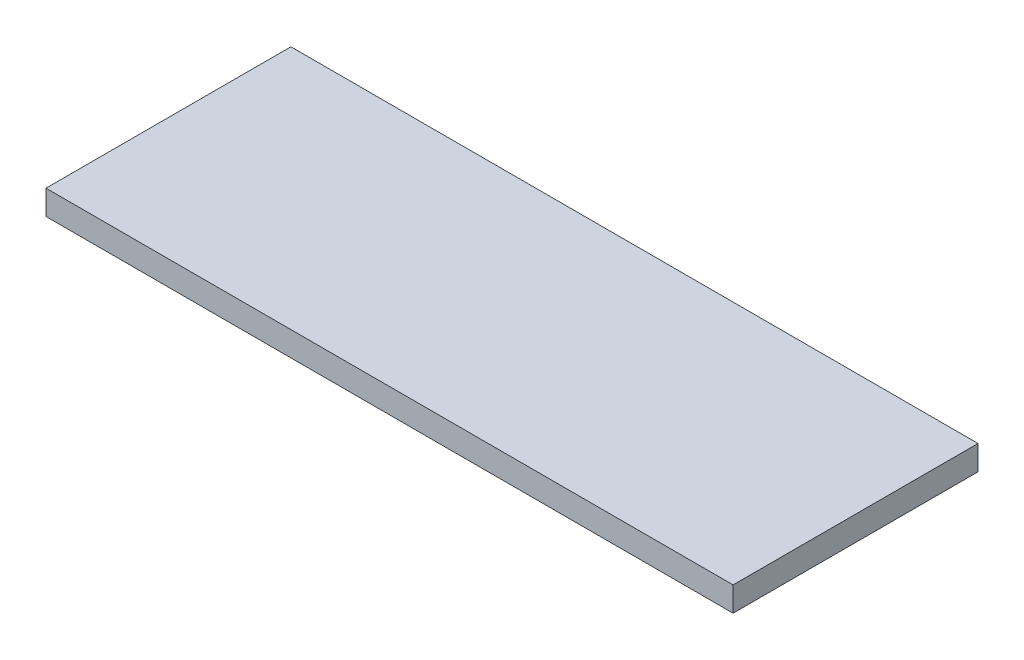
ISO-10303-21;
HEADER;
FILE_DESCRIPTION(('STEP AP214'),'2;1');
FILE_NAME('part.step','',(''),(''),'','','');
FILE_SCHEMA(('AUTOMOTIVE_DESIGN { 1 0 10303 214 1 1 1 1 }'));
ENDSEC;
DATA;
#1=APPLICATION_CONTEXT('core data for automotive mechanical design processes');
#2=APPLICATION_PROTOCOL_DEFINITION('international standard','automotive_design',2000,#1);
#3=PRODUCT_CONTEXT('',#1,'mechanical');
#4=PRODUCT('Part','Part','',(#3));
#5=PRODUCT_RELATED_PRODUCT_CATEGORY('part','',(#4));
#6=PRODUCT_DEFINITION_FORMATION('','',#4);
#7=PRODUCT_DEFINITION_CONTEXT('part definition',#1,'design');
#8=PRODUCT_DEFINITION('design','',#6,#7);
#9=PRODUCT_DEFINITION_SHAPE('','',#8);
#10=(LENGTH_UNIT() NAMED_UNIT(*) SI_UNIT(.MILLI.,.METRE.));
#11=(NAMED_UNIT(*) PLANE_ANGLE_UNIT() SI_UNIT($,.RADIAN.));
#12=(NAMED_UNIT(*) SI_UNIT($,.STERADIAN.) SOLID_ANGLE_UNIT());
#13=UNCERTAINTY_MEASURE_WITH_UNIT(LENGTH_MEASURE(1.E-05),#10,'distance_accuracy_value','');
#14=(GEOMETRIC_REPRESENTATION_CONTEXT(3) GLOBAL_UNCERTAINTY_ASSIGNED_CONTEXT((#13)) GLOBAL_UNIT_ASSIGNED_CONTEXT((#10,
#11,#12)) REPRESENTATION_CONTEXT('',''));
#15=CARTESIAN_POINT('',(0.,0.,0.));
#16=DIRECTION('',(0.,0.,1.));
#17=DIRECTION('',(1.,0.,0.));
#18=AXIS2_PLACEMENT_3D('',#15,#16,#17);
#19=CARTESIAN_POINT('',(-605.779914326901,-4.,0.));
#20=DIRECTION('',(-1.,0.,0.));
#21=DIRECTION('',(0.,0.,1.));
#22=AXIS2_PLACEMENT_3D('',#19,#20,#21);
#23=PLANE('',#22);
#24=DIRECTION('',(0.,0.,1.));
#25=VECTOR('',#24,1.);
#26=CARTESIAN_POINT('',(-605.779914326901,6.,-285.303611354948));
#27=LINE('',#26,#25);
#28=CARTESIAN_POINT('',(-605.779914326901,6.,-285.203611354948));
#29=VERTEX_POINT('',#28);
#30=CARTESIAN_POINT('',(-605.779914326901,6.,-185.403611354948));
#31=VERTEX_POINT('',#30);
#32=EDGE_CURVE('E116',#29,#31,#27,.T.);
#33=ORIENTED_EDGE('',*,*,#32,.F.);
#34=DIRECTION('',(0.,1.,0.));
#35=VECTOR('',#34,1.);
#36=CARTESIAN_POINT('',(-605.779914326901,6.,-285.203611354948));
#37=LINE('',#36,#35);
#38=CARTESIAN_POINT('',(-605.779914326901,-4.,-285.203611354948));
#39=VERTEX_POINT('',#38);
#40=EDGE_CURVE('E60',#39,#29,#37,.T.);
#41=ORIENTED_EDGE('',*,*,#40,.F.);
#42=DIRECTION('',(0.,0.,1.));
#43=VECTOR('',#42,1.);
#44=CARTESIAN_POINT('',(-605.779914326901,-4.,0.));
#45=LINE('',#44,#43);
#46=CARTESIAN_POINT('',(-605.779914326901,-4.,-185.403611354948));
#47=VERTEX_POINT('',#46);
#48=EDGE_CURVE('E100',#39,#47,#45,.T.);
#49=ORIENTED_EDGE('',*,*,#48,.T.);
#50=DIRECTION('',(0.,-1.,0.));
#51=VECTOR('',#50,1.);
#52=CARTESIAN_POINT('',(-605.779914326901,6.,-185.403611354948));
#53=LINE('',#52,#51);
#54=EDGE_CURVE('E126',#31,#47,#53,.T.);
#55=ORIENTED_EDGE('',*,*,#54,.F.);
#56=EDGE_LOOP('',(#33,#41,#49,#55));
#57=FACE_BOUND('',#56,.T.);
#58=ADVANCED_FACE('F43',(#57),#23,.T.);
#59=CARTESIAN_POINT('',(-325.779914326901,-4.,0.));
#60=DIRECTION('',(-1.,0.,0.));
#61=DIRECTION('',(0.,0.,1.));
#62=AXIS2_PLACEMENT_3D('',#59,#60,#61);
#63=PLANE('',#62);
#64=DIRECTION('',(0.,-1.,0.));
#65=VECTOR('',#64,1.);
#66=CARTESIAN_POINT('',(-325.779914326901,6.,-285.203611354948));
#67=LINE('',#66,#65);
#68=CARTESIAN_POINT('',(-325.779914326901,6.,-285.203611354948));
#69=VERTEX_POINT('',#68);
#70=CARTESIAN_POINT('',(-325.779914326901,-4.,-285.203611354948));
#71=VERTEX_POINT('',#70);
#72=EDGE_CURVE('E86',#69,#71,#67,.T.);
#73=ORIENTED_EDGE('',*,*,#72,.F.);
#74=DIRECTION('',(0.,0.,-1.));
#75=VECTOR('',#74,1.);
#76=CARTESIAN_POINT('',(-325.779914326901,6.,-285.303611354948));
#77=LINE('',#76,#75);
#78=CARTESIAN_POINT('',(-325.779914326901,6.,-185.403611354948));
#79=VERTEX_POINT('',#78);
#80=EDGE_CURVE('E113',#79,#69,#77,.T.);
#81=ORIENTED_EDGE('',*,*,#80,.F.);
#82=DIRECTION('',(0.,1.,0.));
#83=VECTOR('',#82,1.);
#84=CARTESIAN_POINT('',(-325.779914326901,6.,-185.403611354948));
#85=LINE('',#84,#83);
#86=CARTESIAN_POINT('',(-325.779914326901,-4.,-185.403611354948));
#87=VERTEX_POINT('',#86);
#88=EDGE_CURVE('E68',#87,#79,#85,.T.);
#89=ORIENTED_EDGE('',*,*,#88,.F.);
#90=DIRECTION('',(0.,0.,1.));
#91=VECTOR('',#90,1.);
#92=CARTESIAN_POINT('',(-325.779914326901,-4.,0.));
#93=LINE('',#92,#91);
#94=EDGE_CURVE('E52',#71,#87,#93,.T.);
#95=ORIENTED_EDGE('',*,*,#94,.F.);
#96=EDGE_LOOP('',(#73,#81,#89,#95));
#97=FACE_BOUND('',#96,.T.);
#98=ADVANCED_FACE('F102',(#97),#63,.F.);
#99=CARTESIAN_POINT('',(0.,-4.,0.));
#100=DIRECTION('',(0.,1.,0.));
#101=DIRECTION('',(0.,0.,1.));
#102=AXIS2_PLACEMENT_3D('',#99,#100,#101);
#103=PLANE('',#102);
#104=CARTESIAN_POINT('',(-402.392880512729,-4.,-240.117860910898));
#105=DIRECTION('',(0.,1.,0.));
#106=DIRECTION('',(0.,0.,1.));
#107=AXIS2_PLACEMENT_3D('',#104,#105,#106);
#108=CIRCLE('',#107,18.55);
#109=CARTESIAN_POINT('',(-402.392880512729,-4.,-221.567860910898));
#110=VERTEX_POINT('',#109);
#111=EDGE_CURVE('E104',#110,#110,#108,.T.);
#112=ORIENTED_EDGE('',*,*,#111,.T.);
#113=EDGE_LOOP('',(#112));
#114=FACE_BOUND('',#113,.T.);
#115=CARTESIAN_POINT('',(-581.279914326901,-4.,-209.803611354948));
#116=DIRECTION('',(0.,1.,0.));
#117=DIRECTION('',(0.,0.,1.));
#118=AXIS2_PLACEMENT_3D('',#115,#116,#117);
#119=CIRCLE('',#118,18.55);
#120=CARTESIAN_POINT('',(-581.279914326901,-4.,-191.253611354948));
#121=VERTEX_POINT('',#120);
#122=EDGE_CURVE('E11',#121,#121,#119,.T.);
#123=ORIENTED_EDGE('',*,*,#122,.T.);
#124=EDGE_LOOP('',(#123));
#125=FACE_BOUND('',#124,.T.);
#126=DIRECTION('',(-1.,0.,0.));
#127=VECTOR('',#126,1.);
#128=CARTESIAN_POINT('',(-325.779914326901,-4.,-285.203611354948));
#129=LINE('',#128,#127);
#130=EDGE_CURVE('E89',#71,#39,#129,.T.);
#131=ORIENTED_EDGE('',*,*,#130,.F.);
#132=ORIENTED_EDGE('',*,*,#94,.T.);
#133=DIRECTION('',(1.,0.,0.));
#134=VECTOR('',#133,1.);
#135=CARTESIAN_POINT('',(-605.779914326901,-4.,-185.403611354948));
#136=LINE('',#135,#134);
#137=EDGE_CURVE('E124',#47,#87,#136,.T.);
#138=ORIENTED_EDGE('',*,*,#137,.F.);
#139=ORIENTED_EDGE('',*,*,#48,.F.);
#140=EDGE_LOOP('',(#131,#132,#138,#139));
#141=FACE_BOUND('',#140,.T.);
#142=ADVANCED_FACE('F98',(#114,#125,#141),#103,.F.);
#143=CARTESIAN_POINT('',(0.,6.,0.));
#144=DIRECTION('',(0.,1.,0.));
#145=DIRECTION('',(0.,0.,1.));
#146=AXIS2_PLACEMENT_3D('',#143,#144,#145);
#147=PLANE('',#146);
#148=ORIENTED_EDGE('',*,*,#80,.T.);
#149=DIRECTION('',(1.,0.,0.));
#150=VECTOR('',#149,1.);
#151=CARTESIAN_POINT('',(-325.779914326901,6.,-285.203611354948));
#152=LINE('',#151,#150);
#153=EDGE_CURVE('E90',#29,#69,#152,.T.);
#154=ORIENTED_EDGE('',*,*,#153,.F.);
#155=ORIENTED_EDGE('',*,*,#32,.T.);
#156=DIRECTION('',(-1.,0.,0.));
#157=VECTOR('',#156,1.);
#158=CARTESIAN_POINT('',(-605.779914326901,6.,-185.403611354948));
#159=LINE('',#158,#157);
#160=EDGE_CURVE('E119',#79,#31,#159,.T.);
#161=ORIENTED_EDGE('',*,*,#160,.F.);
#162=EDGE_LOOP('',(#148,#154,#155,#161));
#163=FACE_BOUND('',#162,.T.);
#164=ADVANCED_FACE('F134',(#163),#147,.T.);
#165=CARTESIAN_POINT('',(-402.392880512729,-4.,-240.117860910898));
#166=DIRECTION('',(0.,1.,0.));
#167=DIRECTION('',(0.,0.,1.));
#168=AXIS2_PLACEMENT_3D('',#165,#166,#167);
#169=CYLINDRICAL_SURFACE('',#168,18.55);
#170=ORIENTED_EDGE('',*,*,#111,.F.);
#171=EDGE_LOOP('',(#170));
#172=FACE_BOUND('',#171,.T.);
#173=CARTESIAN_POINT('',(-402.392880512729,0.,-240.117860910898));
#174=DIRECTION('',(0.,1.,0.));
#175=DIRECTION('',(0.,0.,1.));
#176=AXIS2_PLACEMENT_3D('',#173,#174,#175);
#177=CIRCLE('',#176,18.55);
#178=CARTESIAN_POINT('',(-402.392880512729,0.,-221.567860910898));
#179=VERTEX_POINT('',#178);
#180=EDGE_CURVE('E107',#179,#179,#177,.T.);
#181=ORIENTED_EDGE('',*,*,#180,.T.);
#182=EDGE_LOOP('',(#181));
#183=FACE_BOUND('',#182,.T.);
#184=ADVANCED_FACE('F45',(#172,#183),#169,.F.);
#185=CARTESIAN_POINT('',(-581.279914326901,-4.,-209.803611354948));
#186=DIRECTION('',(0.,1.,0.));
#187=DIRECTION('',(0.,0.,1.));
#188=AXIS2_PLACEMENT_3D('',#185,#186,#187);
#189=CYLINDRICAL_SURFACE('',#188,18.55);
#190=ORIENTED_EDGE('',*,*,#122,.F.);
#191=EDGE_LOOP('',(#190));
#192=FACE_BOUND('',#191,.T.);
#193=CARTESIAN_POINT('',(-581.279914326901,0.,-209.803611354948));
#194=DIRECTION('',(0.,1.,0.));
#195=DIRECTION('',(0.,0.,1.));
#196=AXIS2_PLACEMENT_3D('',#193,#194,#195);
#197=CIRCLE('',#196,18.55);
#198=CARTESIAN_POINT('',(-581.279914326901,0.,-191.253611354948));
#199=VERTEX_POINT('',#198);
#200=EDGE_CURVE('E47',#199,#199,#197,.T.);
#201=ORIENTED_EDGE('',*,*,#200,.T.);
#202=EDGE_LOOP('',(#201));
#203=FACE_BOUND('',#202,.T.);
#204=ADVANCED_FACE('F141',(#192,#203),#189,.F.);
#205=CARTESIAN_POINT('',(0.,0.,0.));
#206=DIRECTION('',(0.,1.,0.));
#207=DIRECTION('',(0.,0.,1.));
#208=AXIS2_PLACEMENT_3D('',#205,#206,#207);
#209=PLANE('',#208);
#210=ORIENTED_EDGE('',*,*,#200,.F.);
#211=EDGE_LOOP('',(#210));
#212=FACE_BOUND('',#211,.T.);
#213=ADVANCED_FACE('F154',(#212),#209,.F.);
#214=ORIENTED_EDGE('',*,*,#180,.F.);
#215=EDGE_LOOP('',(#214));
#216=FACE_BOUND('',#215,.T.);
#217=ADVANCED_FACE('F156',(#216),#209,.F.);
#218=CARTESIAN_POINT('',(0.,0.,-185.403611354948));
#219=DIRECTION('',(0.,0.,1.));
#220=DIRECTION('',(1.,0.,0.));
#221=AXIS2_PLACEMENT_3D('',#218,#219,#220);
#222=PLANE('',#221);
#223=ORIENTED_EDGE('',*,*,#54,.T.);
#224=ORIENTED_EDGE('',*,*,#137,.T.);
#225=ORIENTED_EDGE('',*,*,#88,.T.);
#226=ORIENTED_EDGE('',*,*,#160,.T.);
#227=EDGE_LOOP('',(#223,#224,#225,#226));
#228=FACE_BOUND('',#227,.T.);
#229=ADVANCED_FACE('F131',(#228),#222,.T.);
#230=CARTESIAN_POINT('',(0.,0.,-285.203611354948));
#231=DIRECTION('',(0.,0.,-1.));
#232=DIRECTION('',(-1.,0.,0.));
#233=AXIS2_PLACEMENT_3D('',#230,#231,#232);
#234=PLANE('',#233);
#235=ORIENTED_EDGE('',*,*,#72,.T.);
#236=ORIENTED_EDGE('',*,*,#130,.T.);
#237=ORIENTED_EDGE('',*,*,#40,.T.);
#238=ORIENTED_EDGE('',*,*,#153,.T.);
#239=EDGE_LOOP('',(#235,#236,#237,#238));
#240=FACE_BOUND('',#239,.T.);
#241=ADVANCED_FACE('F88',(#240),#234,.T.);
#242=CLOSED_SHELL('',(#58,#98,#142,#164,#184,#204,#213,#217,#229,#241));
#243=MANIFOLD_SOLID_BREP('B2',#242);
#244=ADVANCED_BREP_SHAPE_REPRESENTATION('',(#18,#243),#14);
#245=SHAPE_DEFINITION_REPRESENTATION(#9,#244);
ENDSEC;
END-ISO-10303-21;
